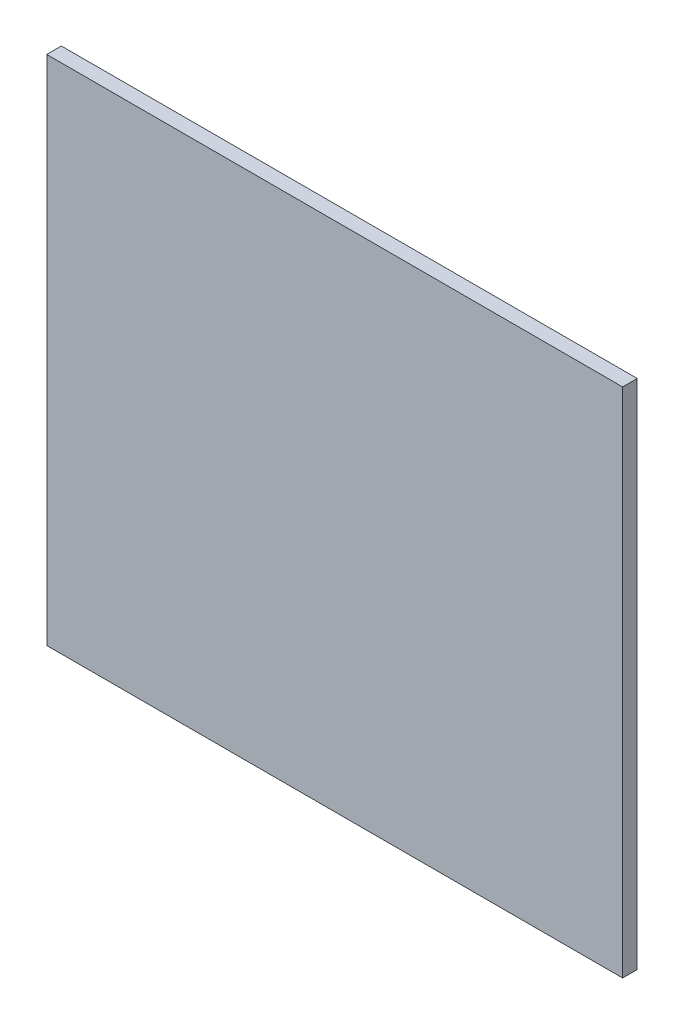
ISO-10303-21;
HEADER;
FILE_DESCRIPTION(('STEP AP214'),'2;1');
FILE_NAME('part.step','',(''),(''),'','','');
FILE_SCHEMA(('AUTOMOTIVE_DESIGN { 1 0 10303 214 1 1 1 1 }'));
ENDSEC;
DATA;
#1=APPLICATION_CONTEXT('core data for automotive mechanical design processes');
#2=APPLICATION_PROTOCOL_DEFINITION('international standard','automotive_design',2000,#1);
#3=PRODUCT_CONTEXT('',#1,'mechanical');
#4=PRODUCT('Part','Part','',(#3));
#5=PRODUCT_RELATED_PRODUCT_CATEGORY('part','',(#4));
#6=PRODUCT_DEFINITION_FORMATION('','',#4);
#7=PRODUCT_DEFINITION_CONTEXT('part definition',#1,'design');
#8=PRODUCT_DEFINITION('design','',#6,#7);
#9=PRODUCT_DEFINITION_SHAPE('','',#8);
#10=(LENGTH_UNIT() NAMED_UNIT(*) SI_UNIT(.MILLI.,.METRE.));
#11=(NAMED_UNIT(*) PLANE_ANGLE_UNIT() SI_UNIT($,.RADIAN.));
#12=(NAMED_UNIT(*) SI_UNIT($,.STERADIAN.) SOLID_ANGLE_UNIT());
#13=UNCERTAINTY_MEASURE_WITH_UNIT(LENGTH_MEASURE(1.E-05),#10,'distance_accuracy_value','');
#14=(GEOMETRIC_REPRESENTATION_CONTEXT(3) GLOBAL_UNCERTAINTY_ASSIGNED_CONTEXT((#13)) GLOBAL_UNIT_ASSIGNED_CONTEXT((#10,
#11,#12)) REPRESENTATION_CONTEXT('',''));
#15=CARTESIAN_POINT('',(0.,0.,0.));
#16=DIRECTION('',(0.,0.,1.));
#17=DIRECTION('',(1.,0.,0.));
#18=AXIS2_PLACEMENT_3D('',#15,#16,#17);
#19=CARTESIAN_POINT('',(0.,0.,2.032));
#20=DIRECTION('',(-1.,0.,0.));
#21=DIRECTION('',(0.,0.,1.));
#22=AXIS2_PLACEMENT_3D('',#19,#20,#21);
#23=PLANE('',#22);
#24=DIRECTION('',(0.,1.,0.));
#25=VECTOR('',#24,1.);
#26=CARTESIAN_POINT('',(0.,0.,0.));
#27=LINE('',#26,#25);
#28=CARTESIAN_POINT('',(0.,0.,0.));
#29=VERTEX_POINT('',#28);
#30=CARTESIAN_POINT('',(0.,71.12,0.));
#31=VERTEX_POINT('',#30);
#32=EDGE_CURVE('E99',#29,#31,#27,.T.);
#33=ORIENTED_EDGE('',*,*,#32,.T.);
#34=DIRECTION('',(0.,0.,-1.));
#35=VECTOR('',#34,1.);
#36=CARTESIAN_POINT('',(0.,71.12,2.032));
#37=LINE('',#36,#35);
#38=CARTESIAN_POINT('',(0.,71.12,2.032));
#39=VERTEX_POINT('',#38);
#40=EDGE_CURVE('E11',#39,#31,#37,.T.);
#41=ORIENTED_EDGE('',*,*,#40,.F.);
#42=DIRECTION('',(0.,1.,0.));
#43=VECTOR('',#42,1.);
#44=CARTESIAN_POINT('',(0.,0.,2.032));
#45=LINE('',#44,#43);
#46=CARTESIAN_POINT('',(0.,0.,2.032));
#47=VERTEX_POINT('',#46);
#48=EDGE_CURVE('E87',#47,#39,#45,.T.);
#49=ORIENTED_EDGE('',*,*,#48,.F.);
#50=DIRECTION('',(0.,0.,-1.));
#51=VECTOR('',#50,1.);
#52=CARTESIAN_POINT('',(0.,0.,2.032));
#53=LINE('',#52,#51);
#54=EDGE_CURVE('E95',#47,#29,#53,.T.);
#55=ORIENTED_EDGE('',*,*,#54,.T.);
#56=EDGE_LOOP('',(#33,#41,#49,#55));
#57=FACE_BOUND('',#56,.T.);
#58=ADVANCED_FACE('F36',(#57),#23,.F.);
#59=CARTESIAN_POINT('',(0.,71.12,2.032));
#60=DIRECTION('',(0.,-1.,0.));
#61=DIRECTION('',(1.,0.,0.));
#62=AXIS2_PLACEMENT_3D('',#59,#60,#61);
#63=PLANE('',#62);
#64=DIRECTION('',(-1.,0.,0.));
#65=VECTOR('',#64,1.);
#66=CARTESIAN_POINT('',(0.,71.12,0.));
#67=LINE('',#66,#65);
#68=CARTESIAN_POINT('',(-80.01,71.12,0.));
#69=VERTEX_POINT('',#68);
#70=EDGE_CURVE('E91',#31,#69,#67,.T.);
#71=ORIENTED_EDGE('',*,*,#70,.T.);
#72=DIRECTION('',(0.,0.,-1.));
#73=VECTOR('',#72,1.);
#74=CARTESIAN_POINT('',(-80.01,71.12,2.032));
#75=LINE('',#74,#73);
#76=CARTESIAN_POINT('',(-80.01,71.12,2.032));
#77=VERTEX_POINT('',#76);
#78=EDGE_CURVE('E44',#77,#69,#75,.T.);
#79=ORIENTED_EDGE('',*,*,#78,.F.);
#80=DIRECTION('',(-1.,0.,0.));
#81=VECTOR('',#80,1.);
#82=CARTESIAN_POINT('',(0.,71.12,2.032));
#83=LINE('',#82,#81);
#84=EDGE_CURVE('E82',#39,#77,#83,.T.);
#85=ORIENTED_EDGE('',*,*,#84,.F.);
#86=ORIENTED_EDGE('',*,*,#40,.T.);
#87=EDGE_LOOP('',(#71,#79,#85,#86));
#88=FACE_BOUND('',#87,.T.);
#89=ADVANCED_FACE('F90',(#88),#63,.F.);
#90=CARTESIAN_POINT('',(-80.01,0.,2.032));
#91=DIRECTION('',(1.,0.,0.));
#92=DIRECTION('',(0.,0.,-1.));
#93=AXIS2_PLACEMENT_3D('',#90,#91,#92);
#94=PLANE('',#93);
#95=DIRECTION('',(0.,-1.,0.));
#96=VECTOR('',#95,1.);
#97=CARTESIAN_POINT('',(-80.01,0.,0.));
#98=LINE('',#97,#96);
#99=CARTESIAN_POINT('',(-80.01,0.,0.));
#100=VERTEX_POINT('',#99);
#101=EDGE_CURVE('E69',#69,#100,#98,.T.);
#102=ORIENTED_EDGE('',*,*,#101,.T.);
#103=DIRECTION('',(0.,0.,-1.));
#104=VECTOR('',#103,1.);
#105=CARTESIAN_POINT('',(-80.01,0.,2.032));
#106=LINE('',#105,#104);
#107=CARTESIAN_POINT('',(-80.01,0.,2.032));
#108=VERTEX_POINT('',#107);
#109=EDGE_CURVE('E92',#108,#100,#106,.T.);
#110=ORIENTED_EDGE('',*,*,#109,.F.);
#111=DIRECTION('',(0.,-1.,0.));
#112=VECTOR('',#111,1.);
#113=CARTESIAN_POINT('',(-80.01,0.,2.032));
#114=LINE('',#113,#112);
#115=EDGE_CURVE('E85',#77,#108,#114,.T.);
#116=ORIENTED_EDGE('',*,*,#115,.F.);
#117=ORIENTED_EDGE('',*,*,#78,.T.);
#118=EDGE_LOOP('',(#102,#110,#116,#117));
#119=FACE_BOUND('',#118,.T.);
#120=ADVANCED_FACE('F93',(#119),#94,.F.);
#121=CARTESIAN_POINT('',(0.,0.,2.032));
#122=DIRECTION('',(0.,1.,0.));
#123=DIRECTION('',(-1.,0.,0.));
#124=AXIS2_PLACEMENT_3D('',#121,#122,#123);
#125=PLANE('',#124);
#126=DIRECTION('',(1.,0.,0.));
#127=VECTOR('',#126,1.);
#128=CARTESIAN_POINT('',(0.,0.,0.));
#129=LINE('',#128,#127);
#130=EDGE_CURVE('E75',#100,#29,#129,.T.);
#131=ORIENTED_EDGE('',*,*,#130,.T.);
#132=ORIENTED_EDGE('',*,*,#54,.F.);
#133=DIRECTION('',(1.,0.,0.));
#134=VECTOR('',#133,1.);
#135=CARTESIAN_POINT('',(0.,0.,2.032));
#136=LINE('',#135,#134);
#137=EDGE_CURVE('E52',#108,#47,#136,.T.);
#138=ORIENTED_EDGE('',*,*,#137,.F.);
#139=ORIENTED_EDGE('',*,*,#109,.T.);
#140=EDGE_LOOP('',(#131,#132,#138,#139));
#141=FACE_BOUND('',#140,.T.);
#142=ADVANCED_FACE('F106',(#141),#125,.F.);
#143=CARTESIAN_POINT('',(0.,0.,2.032));
#144=DIRECTION('',(0.,0.,1.));
#145=DIRECTION('',(1.,0.,0.));
#146=AXIS2_PLACEMENT_3D('',#143,#144,#145);
#147=PLANE('',#146);
#148=ORIENTED_EDGE('',*,*,#48,.T.);
#149=ORIENTED_EDGE('',*,*,#84,.T.);
#150=ORIENTED_EDGE('',*,*,#115,.T.);
#151=ORIENTED_EDGE('',*,*,#137,.T.);
#152=EDGE_LOOP('',(#148,#149,#150,#151));
#153=FACE_BOUND('',#152,.T.);
#154=ADVANCED_FACE('F83',(#153),#147,.T.);
#155=CARTESIAN_POINT('',(0.,0.,0.));
#156=DIRECTION('',(0.,0.,1.));
#157=DIRECTION('',(1.,0.,0.));
#158=AXIS2_PLACEMENT_3D('',#155,#156,#157);
#159=PLANE('',#158);
#160=ORIENTED_EDGE('',*,*,#32,.F.);
#161=ORIENTED_EDGE('',*,*,#130,.F.);
#162=ORIENTED_EDGE('',*,*,#101,.F.);
#163=ORIENTED_EDGE('',*,*,#70,.F.);
#164=EDGE_LOOP('',(#160,#161,#162,#163));
#165=FACE_BOUND('',#164,.T.);
#166=ADVANCED_FACE('F109',(#165),#159,.F.);
#167=CLOSED_SHELL('',(#58,#89,#120,#142,#154,#166));
#168=MANIFOLD_SOLID_BREP('B2',#167);
#169=ADVANCED_BREP_SHAPE_REPRESENTATION('',(#18,#168),#14);
#170=SHAPE_DEFINITION_REPRESENTATION(#9,#169);
ENDSEC;
END-ISO-10303-21;
